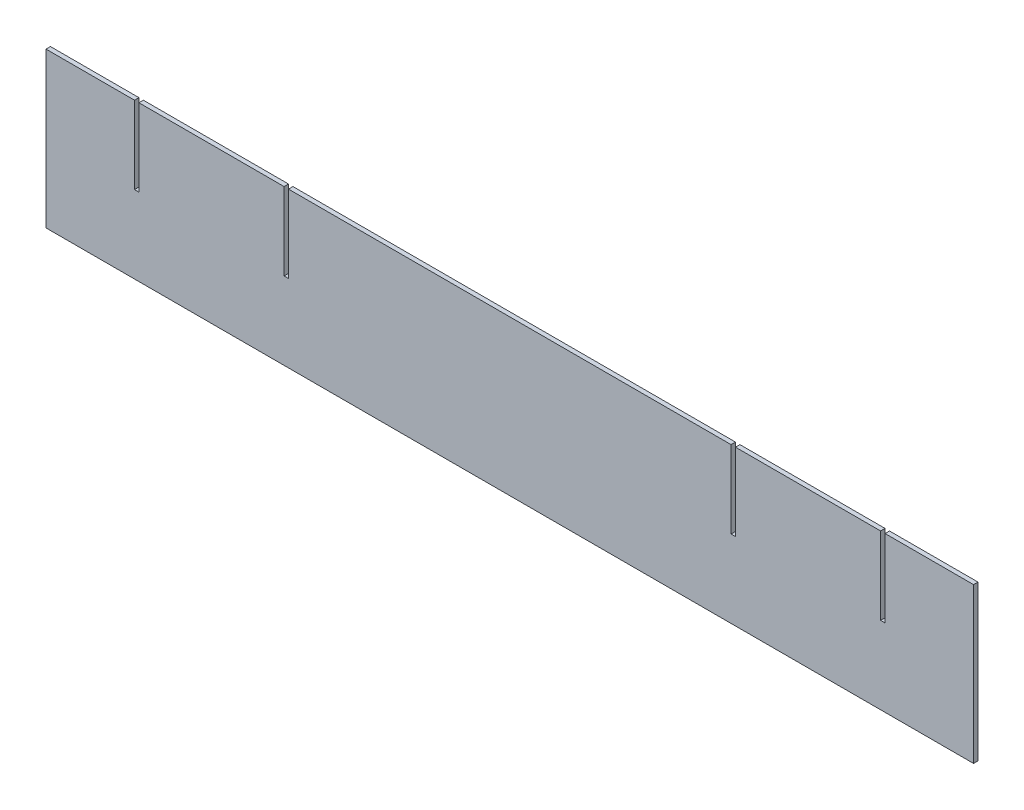
ISO-10303-21;
HEADER;
FILE_DESCRIPTION(('STEP AP214'),'2;1');
FILE_NAME('part.step','',(''),(''),'','','');
FILE_SCHEMA(('AUTOMOTIVE_DESIGN { 1 0 10303 214 1 1 1 1 }'));
ENDSEC;
DATA;
#1=APPLICATION_CONTEXT('core data for automotive mechanical design processes');
#2=APPLICATION_PROTOCOL_DEFINITION('international standard','automotive_design',2000,#1);
#3=PRODUCT_CONTEXT('',#1,'mechanical');
#4=PRODUCT('Part','Part','',(#3));
#5=PRODUCT_RELATED_PRODUCT_CATEGORY('part','',(#4));
#6=PRODUCT_DEFINITION_FORMATION('','',#4);
#7=PRODUCT_DEFINITION_CONTEXT('part definition',#1,'design');
#8=PRODUCT_DEFINITION('design','',#6,#7);
#9=PRODUCT_DEFINITION_SHAPE('','',#8);
#10=(LENGTH_UNIT() NAMED_UNIT(*) SI_UNIT(.MILLI.,.METRE.));
#11=(NAMED_UNIT(*) PLANE_ANGLE_UNIT() SI_UNIT($,.RADIAN.));
#12=(NAMED_UNIT(*) SI_UNIT($,.STERADIAN.) SOLID_ANGLE_UNIT());
#13=UNCERTAINTY_MEASURE_WITH_UNIT(LENGTH_MEASURE(1.E-05),#10,'distance_accuracy_value','');
#14=(GEOMETRIC_REPRESENTATION_CONTEXT(3) GLOBAL_UNCERTAINTY_ASSIGNED_CONTEXT((#13)) GLOBAL_UNIT_ASSIGNED_CONTEXT((#10,
#11,#12)) REPRESENTATION_CONTEXT('',''));
#15=CARTESIAN_POINT('',(0.,0.,0.));
#16=DIRECTION('',(0.,0.,1.));
#17=DIRECTION('',(1.,0.,0.));
#18=AXIS2_PLACEMENT_3D('',#15,#16,#17);
#19=CARTESIAN_POINT('',(-209.6,35.,2.));
#20=DIRECTION('',(0.,-1.,0.));
#21=DIRECTION('',(0.,0.,-1.));
#22=AXIS2_PLACEMENT_3D('',#19,#20,#21);
#23=PLANE('',#22);
#24=DIRECTION('',(-1.,0.,0.));
#25=VECTOR('',#24,1.);
#26=CARTESIAN_POINT('',(-209.6,35.,0.));
#27=LINE('',#26,#25);
#28=CARTESIAN_POINT('',(167.6,35.,0.));
#29=VERTEX_POINT('',#28);
#30=CARTESIAN_POINT('',(102.,35.,0.));
#31=VERTEX_POINT('',#30);
#32=EDGE_CURVE('E193',#29,#31,#27,.T.);
#33=ORIENTED_EDGE('',*,*,#32,.T.);
#34=DIRECTION('',(0.,0.,1.));
#35=VECTOR('',#34,1.);
#36=CARTESIAN_POINT('',(102.,35.,0.));
#37=LINE('',#36,#35);
#38=CARTESIAN_POINT('',(102.,35.,2.));
#39=VERTEX_POINT('',#38);
#40=EDGE_CURVE('E285',#31,#39,#37,.T.);
#41=ORIENTED_EDGE('',*,*,#40,.T.);
#42=DIRECTION('',(-1.,0.,0.));
#43=VECTOR('',#42,1.);
#44=CARTESIAN_POINT('',(-209.6,35.,2.));
#45=LINE('',#44,#43);
#46=CARTESIAN_POINT('',(167.6,35.,2.));
#47=VERTEX_POINT('',#46);
#48=EDGE_CURVE('E250',#47,#39,#45,.T.);
#49=ORIENTED_EDGE('',*,*,#48,.F.);
#50=DIRECTION('',(0.,0.,1.));
#51=VECTOR('',#50,1.);
#52=CARTESIAN_POINT('',(167.6,35.,0.));
#53=LINE('',#52,#51);
#54=EDGE_CURVE('E247',#29,#47,#53,.T.);
#55=ORIENTED_EDGE('',*,*,#54,.F.);
#56=EDGE_LOOP('',(#33,#41,#49,#55));
#57=FACE_BOUND('',#56,.T.);
#58=ADVANCED_FACE('F32',(#57),#23,.F.);
#59=CARTESIAN_POINT('',(100.,35.,2.));
#60=VERTEX_POINT('',#59);
#61=CARTESIAN_POINT('',(-100.,35.,2.));
#62=VERTEX_POINT('',#61);
#63=EDGE_CURVE('E186',#60,#62,#45,.T.);
#64=ORIENTED_EDGE('',*,*,#63,.F.);
#65=DIRECTION('',(0.,0.,1.));
#66=VECTOR('',#65,1.);
#67=CARTESIAN_POINT('',(100.,35.,0.));
#68=LINE('',#67,#66);
#69=CARTESIAN_POINT('',(100.,35.,0.));
#70=VERTEX_POINT('',#69);
#71=EDGE_CURVE('E172',#70,#60,#68,.T.);
#72=ORIENTED_EDGE('',*,*,#71,.F.);
#73=CARTESIAN_POINT('',(-100.,35.,0.));
#74=VERTEX_POINT('',#73);
#75=EDGE_CURVE('E184',#70,#74,#27,.T.);
#76=ORIENTED_EDGE('',*,*,#75,.T.);
#77=DIRECTION('',(0.,0.,1.));
#78=VECTOR('',#77,1.);
#79=CARTESIAN_POINT('',(-100.,35.,0.));
#80=LINE('',#79,#78);
#81=EDGE_CURVE('E343',#74,#62,#80,.T.);
#82=ORIENTED_EDGE('',*,*,#81,.T.);
#83=EDGE_LOOP('',(#64,#72,#76,#82));
#84=FACE_BOUND('',#83,.T.);
#85=ADVANCED_FACE('F182',(#84),#23,.F.);
#86=CARTESIAN_POINT('',(-102.,35.,2.));
#87=VERTEX_POINT('',#86);
#88=CARTESIAN_POINT('',(-167.6,35.,2.));
#89=VERTEX_POINT('',#88);
#90=EDGE_CURVE('E243',#87,#89,#45,.T.);
#91=ORIENTED_EDGE('',*,*,#90,.F.);
#92=DIRECTION('',(0.,0.,1.));
#93=VECTOR('',#92,1.);
#94=CARTESIAN_POINT('',(-102.,35.,0.));
#95=LINE('',#94,#93);
#96=CARTESIAN_POINT('',(-102.,35.,0.));
#97=VERTEX_POINT('',#96);
#98=EDGE_CURVE('E320',#97,#87,#95,.T.);
#99=ORIENTED_EDGE('',*,*,#98,.F.);
#100=CARTESIAN_POINT('',(-167.6,35.,0.));
#101=VERTEX_POINT('',#100);
#102=EDGE_CURVE('E194',#97,#101,#27,.T.);
#103=ORIENTED_EDGE('',*,*,#102,.T.);
#104=DIRECTION('',(0.,0.,1.));
#105=VECTOR('',#104,1.);
#106=CARTESIAN_POINT('',(-167.6,35.,0.));
#107=LINE('',#106,#105);
#108=EDGE_CURVE('E322',#101,#89,#107,.T.);
#109=ORIENTED_EDGE('',*,*,#108,.T.);
#110=EDGE_LOOP('',(#91,#99,#103,#109));
#111=FACE_BOUND('',#110,.T.);
#112=ADVANCED_FACE('F319',(#111),#23,.F.);
#113=CARTESIAN_POINT('',(209.6,35.,0.));
#114=VERTEX_POINT('',#113);
#115=CARTESIAN_POINT('',(169.6,35.,0.));
#116=VERTEX_POINT('',#115);
#117=EDGE_CURVE('E197',#114,#116,#27,.T.);
#118=ORIENTED_EDGE('',*,*,#117,.T.);
#119=DIRECTION('',(0.,0.,1.));
#120=VECTOR('',#119,1.);
#121=CARTESIAN_POINT('',(169.6,35.,0.));
#122=LINE('',#121,#120);
#123=CARTESIAN_POINT('',(169.6,35.,2.));
#124=VERTEX_POINT('',#123);
#125=EDGE_CURVE('E289',#116,#124,#122,.T.);
#126=ORIENTED_EDGE('',*,*,#125,.T.);
#127=CARTESIAN_POINT('',(209.6,35.,2.));
#128=VERTEX_POINT('',#127);
#129=EDGE_CURVE('E245',#128,#124,#45,.T.);
#130=ORIENTED_EDGE('',*,*,#129,.F.);
#131=DIRECTION('',(0.,0.,-1.));
#132=VECTOR('',#131,1.);
#133=CARTESIAN_POINT('',(209.6,35.,2.));
#134=LINE('',#133,#132);
#135=EDGE_CURVE('E11',#128,#114,#134,.T.);
#136=ORIENTED_EDGE('',*,*,#135,.T.);
#137=EDGE_LOOP('',(#118,#126,#130,#136));
#138=FACE_BOUND('',#137,.T.);
#139=ADVANCED_FACE('F386',(#138),#23,.F.);
#140=CARTESIAN_POINT('',(209.6,35.,2.));
#141=DIRECTION('',(-1.,0.,0.));
#142=DIRECTION('',(0.,0.,1.));
#143=AXIS2_PLACEMENT_3D('',#140,#141,#142);
#144=PLANE('',#143);
#145=DIRECTION('',(0.,1.,0.));
#146=VECTOR('',#145,1.);
#147=CARTESIAN_POINT('',(209.6,35.,0.));
#148=LINE('',#147,#146);
#149=CARTESIAN_POINT('',(209.6,-35.,0.));
#150=VERTEX_POINT('',#149);
#151=EDGE_CURVE('E204',#150,#114,#148,.T.);
#152=ORIENTED_EDGE('',*,*,#151,.T.);
#153=ORIENTED_EDGE('',*,*,#135,.F.);
#154=DIRECTION('',(0.,1.,0.));
#155=VECTOR('',#154,1.);
#156=CARTESIAN_POINT('',(209.6,35.,2.));
#157=LINE('',#156,#155);
#158=CARTESIAN_POINT('',(209.6,-35.,2.));
#159=VERTEX_POINT('',#158);
#160=EDGE_CURVE('E209',#159,#128,#157,.T.);
#161=ORIENTED_EDGE('',*,*,#160,.F.);
#162=DIRECTION('',(0.,0.,-1.));
#163=VECTOR('',#162,1.);
#164=CARTESIAN_POINT('',(209.6,-35.,2.));
#165=LINE('',#164,#163);
#166=EDGE_CURVE('E210',#159,#150,#165,.T.);
#167=ORIENTED_EDGE('',*,*,#166,.T.);
#168=EDGE_LOOP('',(#152,#153,#161,#167));
#169=FACE_BOUND('',#168,.T.);
#170=ADVANCED_FACE('F34',(#169),#144,.F.);
#171=CARTESIAN_POINT('',(-169.6,35.,2.));
#172=VERTEX_POINT('',#171);
#173=CARTESIAN_POINT('',(-209.6,35.,2.));
#174=VERTEX_POINT('',#173);
#175=EDGE_CURVE('E241',#172,#174,#45,.T.);
#176=ORIENTED_EDGE('',*,*,#175,.F.);
#177=DIRECTION('',(0.,0.,1.));
#178=VECTOR('',#177,1.);
#179=CARTESIAN_POINT('',(-169.6,35.,0.));
#180=LINE('',#179,#178);
#181=CARTESIAN_POINT('',(-169.6,35.,0.));
#182=VERTEX_POINT('',#181);
#183=EDGE_CURVE('E259',#182,#172,#180,.T.);
#184=ORIENTED_EDGE('',*,*,#183,.F.);
#185=CARTESIAN_POINT('',(-209.6,35.,0.));
#186=VERTEX_POINT('',#185);
#187=EDGE_CURVE('E199',#182,#186,#27,.T.);
#188=ORIENTED_EDGE('',*,*,#187,.T.);
#189=DIRECTION('',(0.,0.,-1.));
#190=VECTOR('',#189,1.);
#191=CARTESIAN_POINT('',(-209.6,35.,2.));
#192=LINE('',#191,#190);
#193=EDGE_CURVE('E40',#174,#186,#192,.T.);
#194=ORIENTED_EDGE('',*,*,#193,.F.);
#195=EDGE_LOOP('',(#176,#184,#188,#194));
#196=FACE_BOUND('',#195,.T.);
#197=ADVANCED_FACE('F258',(#196),#23,.F.);
#198=CARTESIAN_POINT('',(-209.6,35.,2.));
#199=DIRECTION('',(1.,0.,0.));
#200=DIRECTION('',(0.,0.,-1.));
#201=AXIS2_PLACEMENT_3D('',#198,#199,#200);
#202=PLANE('',#201);
#203=DIRECTION('',(0.,-1.,0.));
#204=VECTOR('',#203,1.);
#205=CARTESIAN_POINT('',(-209.6,35.,0.));
#206=LINE('',#205,#204);
#207=CARTESIAN_POINT('',(-209.6,-35.,0.));
#208=VERTEX_POINT('',#207);
#209=EDGE_CURVE('E203',#186,#208,#206,.T.);
#210=ORIENTED_EDGE('',*,*,#209,.T.);
#211=DIRECTION('',(0.,0.,-1.));
#212=VECTOR('',#211,1.);
#213=CARTESIAN_POINT('',(-209.6,-35.,2.));
#214=LINE('',#213,#212);
#215=CARTESIAN_POINT('',(-209.6,-35.,2.));
#216=VERTEX_POINT('',#215);
#217=EDGE_CURVE('E213',#216,#208,#214,.T.);
#218=ORIENTED_EDGE('',*,*,#217,.F.);
#219=DIRECTION('',(0.,-1.,0.));
#220=VECTOR('',#219,1.);
#221=CARTESIAN_POINT('',(-209.6,35.,2.));
#222=LINE('',#221,#220);
#223=EDGE_CURVE('E223',#174,#216,#222,.T.);
#224=ORIENTED_EDGE('',*,*,#223,.F.);
#225=ORIENTED_EDGE('',*,*,#193,.T.);
#226=EDGE_LOOP('',(#210,#218,#224,#225));
#227=FACE_BOUND('',#226,.T.);
#228=ADVANCED_FACE('F221',(#227),#202,.F.);
#229=CARTESIAN_POINT('',(-209.6,-35.,2.));
#230=DIRECTION('',(0.,1.,0.));
#231=DIRECTION('',(0.,0.,1.));
#232=AXIS2_PLACEMENT_3D('',#229,#230,#231);
#233=PLANE('',#232);
#234=DIRECTION('',(1.,0.,0.));
#235=VECTOR('',#234,1.);
#236=CARTESIAN_POINT('',(-209.6,-35.,0.));
#237=LINE('',#236,#235);
#238=EDGE_CURVE('E207',#208,#150,#237,.T.);
#239=ORIENTED_EDGE('',*,*,#238,.T.);
#240=ORIENTED_EDGE('',*,*,#166,.F.);
#241=DIRECTION('',(1.,0.,0.));
#242=VECTOR('',#241,1.);
#243=CARTESIAN_POINT('',(-209.6,-35.,2.));
#244=LINE('',#243,#242);
#245=EDGE_CURVE('E214',#216,#159,#244,.T.);
#246=ORIENTED_EDGE('',*,*,#245,.F.);
#247=ORIENTED_EDGE('',*,*,#217,.T.);
#248=EDGE_LOOP('',(#239,#240,#246,#247));
#249=FACE_BOUND('',#248,.T.);
#250=ADVANCED_FACE('F233',(#249),#233,.F.);
#251=CARTESIAN_POINT('',(0.,0.,2.));
#252=DIRECTION('',(0.,0.,1.));
#253=DIRECTION('',(1.,0.,0.));
#254=AXIS2_PLACEMENT_3D('',#251,#252,#253);
#255=PLANE('',#254);
#256=DIRECTION('',(0.,1.,0.));
#257=VECTOR('',#256,1.);
#258=CARTESIAN_POINT('',(102.,35.,2.));
#259=LINE('',#258,#257);
#260=CARTESIAN_POINT('',(102.,0.,2.));
#261=VERTEX_POINT('',#260);
#262=EDGE_CURVE('E177',#261,#39,#259,.T.);
#263=ORIENTED_EDGE('',*,*,#262,.F.);
#264=DIRECTION('',(1.,0.,0.));
#265=VECTOR('',#264,1.);
#266=CARTESIAN_POINT('',(102.,0.,2.));
#267=LINE('',#266,#265);
#268=CARTESIAN_POINT('',(100.,0.,2.));
#269=VERTEX_POINT('',#268);
#270=EDGE_CURVE('E360',#269,#261,#267,.T.);
#271=ORIENTED_EDGE('',*,*,#270,.F.);
#272=DIRECTION('',(0.,-1.,0.));
#273=VECTOR('',#272,1.);
#274=CARTESIAN_POINT('',(100.,0.,2.));
#275=LINE('',#274,#273);
#276=EDGE_CURVE('E345',#60,#269,#275,.T.);
#277=ORIENTED_EDGE('',*,*,#276,.F.);
#278=ORIENTED_EDGE('',*,*,#63,.T.);
#279=DIRECTION('',(0.,1.,0.));
#280=VECTOR('',#279,1.);
#281=CARTESIAN_POINT('',(-100.,35.,2.));
#282=LINE('',#281,#280);
#283=CARTESIAN_POINT('',(-100.,0.,2.));
#284=VERTEX_POINT('',#283);
#285=EDGE_CURVE('E346',#284,#62,#282,.T.);
#286=ORIENTED_EDGE('',*,*,#285,.F.);
#287=DIRECTION('',(1.,0.,0.));
#288=VECTOR('',#287,1.);
#289=CARTESIAN_POINT('',(-100.,0.,2.));
#290=LINE('',#289,#288);
#291=CARTESIAN_POINT('',(-102.,0.,2.));
#292=VERTEX_POINT('',#291);
#293=EDGE_CURVE('E326',#292,#284,#290,.T.);
#294=ORIENTED_EDGE('',*,*,#293,.F.);
#295=DIRECTION('',(0.,-1.,0.));
#296=VECTOR('',#295,1.);
#297=CARTESIAN_POINT('',(-102.,0.,2.));
#298=LINE('',#297,#296);
#299=EDGE_CURVE('E315',#87,#292,#298,.T.);
#300=ORIENTED_EDGE('',*,*,#299,.F.);
#301=ORIENTED_EDGE('',*,*,#90,.T.);
#302=DIRECTION('',(0.,1.,0.));
#303=VECTOR('',#302,1.);
#304=CARTESIAN_POINT('',(-167.6,35.,2.));
#305=LINE('',#304,#303);
#306=CARTESIAN_POINT('',(-167.6,0.,2.));
#307=VERTEX_POINT('',#306);
#308=EDGE_CURVE('E312',#307,#89,#305,.T.);
#309=ORIENTED_EDGE('',*,*,#308,.F.);
#310=DIRECTION('',(1.,0.,0.));
#311=VECTOR('',#310,1.);
#312=CARTESIAN_POINT('',(-167.6,0.,2.));
#313=LINE('',#312,#311);
#314=CARTESIAN_POINT('',(-169.6,0.,2.));
#315=VERTEX_POINT('',#314);
#316=EDGE_CURVE('E331',#315,#307,#313,.T.);
#317=ORIENTED_EDGE('',*,*,#316,.F.);
#318=DIRECTION('',(0.,-1.,0.));
#319=VECTOR('',#318,1.);
#320=CARTESIAN_POINT('',(-169.6,0.,2.));
#321=LINE('',#320,#319);
#322=EDGE_CURVE('E256',#172,#315,#321,.T.);
#323=ORIENTED_EDGE('',*,*,#322,.F.);
#324=ORIENTED_EDGE('',*,*,#175,.T.);
#325=ORIENTED_EDGE('',*,*,#223,.T.);
#326=ORIENTED_EDGE('',*,*,#245,.T.);
#327=ORIENTED_EDGE('',*,*,#160,.T.);
#328=ORIENTED_EDGE('',*,*,#129,.T.);
#329=DIRECTION('',(0.,1.,0.));
#330=VECTOR('',#329,1.);
#331=CARTESIAN_POINT('',(169.6,35.,2.));
#332=LINE('',#331,#330);
#333=CARTESIAN_POINT('',(169.6,0.,2.));
#334=VERTEX_POINT('',#333);
#335=EDGE_CURVE('E275',#334,#124,#332,.T.);
#336=ORIENTED_EDGE('',*,*,#335,.F.);
#337=DIRECTION('',(1.,0.,0.));
#338=VECTOR('',#337,1.);
#339=CARTESIAN_POINT('',(169.6,0.,2.));
#340=LINE('',#339,#338);
#341=CARTESIAN_POINT('',(167.6,0.,2.));
#342=VERTEX_POINT('',#341);
#343=EDGE_CURVE('E284',#342,#334,#340,.T.);
#344=ORIENTED_EDGE('',*,*,#343,.F.);
#345=DIRECTION('',(0.,-1.,0.));
#346=VECTOR('',#345,1.);
#347=CARTESIAN_POINT('',(167.6,0.,2.));
#348=LINE('',#347,#346);
#349=EDGE_CURVE('E281',#47,#342,#348,.T.);
#350=ORIENTED_EDGE('',*,*,#349,.F.);
#351=ORIENTED_EDGE('',*,*,#48,.T.);
#352=EDGE_LOOP('',(#263,#271,#277,#278,#286,#294,#300,#301,#309,#317,#323,#324,#325,#326,#327,
#328,#336,#344,#350,#351));
#353=FACE_BOUND('',#352,.T.);
#354=ADVANCED_FACE('F252',(#353),#255,.T.);
#355=CARTESIAN_POINT('',(0.,0.,0.));
#356=DIRECTION('',(0.,0.,1.));
#357=DIRECTION('',(1.,0.,0.));
#358=AXIS2_PLACEMENT_3D('',#355,#356,#357);
#359=PLANE('',#358);
#360=DIRECTION('',(1.,0.,0.));
#361=VECTOR('',#360,1.);
#362=CARTESIAN_POINT('',(102.,0.,0.));
#363=LINE('',#362,#361);
#364=CARTESIAN_POINT('',(100.,0.,0.));
#365=VERTEX_POINT('',#364);
#366=CARTESIAN_POINT('',(102.,0.,0.));
#367=VERTEX_POINT('',#366);
#368=EDGE_CURVE('E47',#365,#367,#363,.T.);
#369=ORIENTED_EDGE('',*,*,#368,.T.);
#370=DIRECTION('',(0.,1.,0.));
#371=VECTOR('',#370,1.);
#372=CARTESIAN_POINT('',(102.,35.,0.));
#373=LINE('',#372,#371);
#374=EDGE_CURVE('E187',#367,#31,#373,.T.);
#375=ORIENTED_EDGE('',*,*,#374,.T.);
#376=ORIENTED_EDGE('',*,*,#32,.F.);
#377=DIRECTION('',(0.,-1.,0.));
#378=VECTOR('',#377,1.);
#379=CARTESIAN_POINT('',(167.6,0.,0.));
#380=LINE('',#379,#378);
#381=CARTESIAN_POINT('',(167.6,0.,0.));
#382=VERTEX_POINT('',#381);
#383=EDGE_CURVE('E271',#29,#382,#380,.T.);
#384=ORIENTED_EDGE('',*,*,#383,.T.);
#385=DIRECTION('',(1.,0.,0.));
#386=VECTOR('',#385,1.);
#387=CARTESIAN_POINT('',(169.6,0.,0.));
#388=LINE('',#387,#386);
#389=CARTESIAN_POINT('',(169.6,0.,0.));
#390=VERTEX_POINT('',#389);
#391=EDGE_CURVE('E274',#382,#390,#388,.T.);
#392=ORIENTED_EDGE('',*,*,#391,.T.);
#393=DIRECTION('',(0.,1.,0.));
#394=VECTOR('',#393,1.);
#395=CARTESIAN_POINT('',(169.6,35.,0.));
#396=LINE('',#395,#394);
#397=EDGE_CURVE('E278',#390,#116,#396,.T.);
#398=ORIENTED_EDGE('',*,*,#397,.T.);
#399=ORIENTED_EDGE('',*,*,#117,.F.);
#400=ORIENTED_EDGE('',*,*,#151,.F.);
#401=ORIENTED_EDGE('',*,*,#238,.F.);
#402=ORIENTED_EDGE('',*,*,#209,.F.);
#403=ORIENTED_EDGE('',*,*,#187,.F.);
#404=DIRECTION('',(0.,-1.,0.));
#405=VECTOR('',#404,1.);
#406=CARTESIAN_POINT('',(-169.6,0.,0.));
#407=LINE('',#406,#405);
#408=CARTESIAN_POINT('',(-169.6,0.,0.));
#409=VERTEX_POINT('',#408);
#410=EDGE_CURVE('E330',#182,#409,#407,.T.);
#411=ORIENTED_EDGE('',*,*,#410,.T.);
#412=DIRECTION('',(1.,0.,0.));
#413=VECTOR('',#412,1.);
#414=CARTESIAN_POINT('',(-167.6,0.,0.));
#415=LINE('',#414,#413);
#416=CARTESIAN_POINT('',(-167.6,0.,0.));
#417=VERTEX_POINT('',#416);
#418=EDGE_CURVE('E267',#409,#417,#415,.T.);
#419=ORIENTED_EDGE('',*,*,#418,.T.);
#420=DIRECTION('',(0.,1.,0.));
#421=VECTOR('',#420,1.);
#422=CARTESIAN_POINT('',(-167.6,35.,0.));
#423=LINE('',#422,#421);
#424=EDGE_CURVE('E262',#417,#101,#423,.T.);
#425=ORIENTED_EDGE('',*,*,#424,.T.);
#426=ORIENTED_EDGE('',*,*,#102,.F.);
#427=DIRECTION('',(0.,-1.,0.));
#428=VECTOR('',#427,1.);
#429=CARTESIAN_POINT('',(-102.,0.,0.));
#430=LINE('',#429,#428);
#431=CARTESIAN_POINT('',(-102.,0.,0.));
#432=VERTEX_POINT('',#431);
#433=EDGE_CURVE('E348',#97,#432,#430,.T.);
#434=ORIENTED_EDGE('',*,*,#433,.T.);
#435=DIRECTION('',(1.,0.,0.));
#436=VECTOR('',#435,1.);
#437=CARTESIAN_POINT('',(-100.,0.,0.));
#438=LINE('',#437,#436);
#439=CARTESIAN_POINT('',(-100.,0.,0.));
#440=VERTEX_POINT('',#439);
#441=EDGE_CURVE('E55',#432,#440,#438,.T.);
#442=ORIENTED_EDGE('',*,*,#441,.T.);
#443=DIRECTION('',(0.,1.,0.));
#444=VECTOR('',#443,1.);
#445=CARTESIAN_POINT('',(-100.,35.,0.));
#446=LINE('',#445,#444);
#447=EDGE_CURVE('E192',#440,#74,#446,.T.);
#448=ORIENTED_EDGE('',*,*,#447,.T.);
#449=ORIENTED_EDGE('',*,*,#75,.F.);
#450=DIRECTION('',(0.,-1.,0.));
#451=VECTOR('',#450,1.);
#452=CARTESIAN_POINT('',(100.,0.,0.));
#453=LINE('',#452,#451);
#454=EDGE_CURVE('E168',#70,#365,#453,.T.);
#455=ORIENTED_EDGE('',*,*,#454,.T.);
#456=EDGE_LOOP('',(#369,#375,#376,#384,#392,#398,#399,#400,#401,#402,#403,#411,#419,#425,#426,
#434,#442,#448,#449,#455));
#457=FACE_BOUND('',#456,.T.);
#458=ADVANCED_FACE('F190',(#457),#359,.F.);
#459=CARTESIAN_POINT('',(169.6,35.,0.));
#460=DIRECTION('',(1.,0.,0.));
#461=DIRECTION('',(0.,0.,-1.));
#462=AXIS2_PLACEMENT_3D('',#459,#460,#461);
#463=PLANE('',#462);
#464=ORIENTED_EDGE('',*,*,#335,.T.);
#465=ORIENTED_EDGE('',*,*,#125,.F.);
#466=ORIENTED_EDGE('',*,*,#397,.F.);
#467=DIRECTION('',(0.,0.,1.));
#468=VECTOR('',#467,1.);
#469=CARTESIAN_POINT('',(169.6,0.,0.));
#470=LINE('',#469,#468);
#471=EDGE_CURVE('E292',#390,#334,#470,.T.);
#472=ORIENTED_EDGE('',*,*,#471,.T.);
#473=EDGE_LOOP('',(#464,#465,#466,#472));
#474=FACE_BOUND('',#473,.T.);
#475=ADVANCED_FACE('F398',(#474),#463,.F.);
#476=CARTESIAN_POINT('',(169.6,0.,0.));
#477=DIRECTION('',(0.,-1.,0.));
#478=DIRECTION('',(1.,0.,0.));
#479=AXIS2_PLACEMENT_3D('',#476,#477,#478);
#480=PLANE('',#479);
#481=ORIENTED_EDGE('',*,*,#343,.T.);
#482=ORIENTED_EDGE('',*,*,#471,.F.);
#483=ORIENTED_EDGE('',*,*,#391,.F.);
#484=DIRECTION('',(0.,0.,1.));
#485=VECTOR('',#484,1.);
#486=CARTESIAN_POINT('',(167.6,0.,0.));
#487=LINE('',#486,#485);
#488=EDGE_CURVE('E293',#382,#342,#487,.T.);
#489=ORIENTED_EDGE('',*,*,#488,.T.);
#490=EDGE_LOOP('',(#481,#482,#483,#489));
#491=FACE_BOUND('',#490,.T.);
#492=ADVANCED_FACE('F399',(#491),#480,.F.);
#493=CARTESIAN_POINT('',(167.6,0.,0.));
#494=DIRECTION('',(-1.,0.,0.));
#495=DIRECTION('',(0.,0.,1.));
#496=AXIS2_PLACEMENT_3D('',#493,#494,#495);
#497=PLANE('',#496);
#498=ORIENTED_EDGE('',*,*,#349,.T.);
#499=ORIENTED_EDGE('',*,*,#488,.F.);
#500=ORIENTED_EDGE('',*,*,#383,.F.);
#501=ORIENTED_EDGE('',*,*,#54,.T.);
#502=EDGE_LOOP('',(#498,#499,#500,#501));
#503=FACE_BOUND('',#502,.T.);
#504=ADVANCED_FACE('F299',(#503),#497,.F.);
#505=CARTESIAN_POINT('',(-167.6,35.,0.));
#506=DIRECTION('',(1.,0.,0.));
#507=DIRECTION('',(0.,1.,0.));
#508=AXIS2_PLACEMENT_3D('',#505,#506,#507);
#509=PLANE('',#508);
#510=ORIENTED_EDGE('',*,*,#308,.T.);
#511=ORIENTED_EDGE('',*,*,#108,.F.);
#512=ORIENTED_EDGE('',*,*,#424,.F.);
#513=DIRECTION('',(0.,0.,1.));
#514=VECTOR('',#513,1.);
#515=CARTESIAN_POINT('',(-167.6,0.,0.));
#516=LINE('',#515,#514);
#517=EDGE_CURVE('E264',#417,#307,#516,.T.);
#518=ORIENTED_EDGE('',*,*,#517,.T.);
#519=EDGE_LOOP('',(#510,#511,#512,#518));
#520=FACE_BOUND('',#519,.T.);
#521=ADVANCED_FACE('F406',(#520),#509,.F.);
#522=CARTESIAN_POINT('',(-167.6,0.,0.));
#523=DIRECTION('',(0.,-1.,0.));
#524=DIRECTION('',(0.,0.,-1.));
#525=AXIS2_PLACEMENT_3D('',#522,#523,#524);
#526=PLANE('',#525);
#527=ORIENTED_EDGE('',*,*,#316,.T.);
#528=ORIENTED_EDGE('',*,*,#517,.F.);
#529=ORIENTED_EDGE('',*,*,#418,.F.);
#530=DIRECTION('',(0.,0.,1.));
#531=VECTOR('',#530,1.);
#532=CARTESIAN_POINT('',(-169.6,0.,0.));
#533=LINE('',#532,#531);
#534=EDGE_CURVE('E261',#409,#315,#533,.T.);
#535=ORIENTED_EDGE('',*,*,#534,.T.);
#536=EDGE_LOOP('',(#527,#528,#529,#535));
#537=FACE_BOUND('',#536,.T.);
#538=ADVANCED_FACE('F452',(#537),#526,.F.);
#539=CARTESIAN_POINT('',(-169.6,0.,0.));
#540=DIRECTION('',(-1.,0.,0.));
#541=DIRECTION('',(0.,0.,1.));
#542=AXIS2_PLACEMENT_3D('',#539,#540,#541);
#543=PLANE('',#542);
#544=ORIENTED_EDGE('',*,*,#322,.T.);
#545=ORIENTED_EDGE('',*,*,#534,.F.);
#546=ORIENTED_EDGE('',*,*,#410,.F.);
#547=ORIENTED_EDGE('',*,*,#183,.T.);
#548=EDGE_LOOP('',(#544,#545,#546,#547));
#549=FACE_BOUND('',#548,.T.);
#550=ADVANCED_FACE('F461',(#549),#543,.F.);
#551=CARTESIAN_POINT('',(-100.,35.,0.));
#552=DIRECTION('',(1.,0.,0.));
#553=DIRECTION('',(0.,0.,-1.));
#554=AXIS2_PLACEMENT_3D('',#551,#552,#553);
#555=PLANE('',#554);
#556=ORIENTED_EDGE('',*,*,#285,.T.);
#557=ORIENTED_EDGE('',*,*,#81,.F.);
#558=ORIENTED_EDGE('',*,*,#447,.F.);
#559=DIRECTION('',(0.,0.,1.));
#560=VECTOR('',#559,1.);
#561=CARTESIAN_POINT('',(-100.,0.,0.));
#562=LINE('',#561,#560);
#563=EDGE_CURVE('E341',#440,#284,#562,.T.);
#564=ORIENTED_EDGE('',*,*,#563,.T.);
#565=EDGE_LOOP('',(#556,#557,#558,#564));
#566=FACE_BOUND('',#565,.T.);
#567=ADVANCED_FACE('F471',(#566),#555,.F.);
#568=CARTESIAN_POINT('',(-100.,0.,0.));
#569=DIRECTION('',(0.,-1.,0.));
#570=DIRECTION('',(0.,0.,-1.));
#571=AXIS2_PLACEMENT_3D('',#568,#569,#570);
#572=PLANE('',#571);
#573=ORIENTED_EDGE('',*,*,#293,.T.);
#574=ORIENTED_EDGE('',*,*,#563,.F.);
#575=ORIENTED_EDGE('',*,*,#441,.F.);
#576=DIRECTION('',(0.,0.,1.));
#577=VECTOR('',#576,1.);
#578=CARTESIAN_POINT('',(-102.,0.,0.));
#579=LINE('',#578,#577);
#580=EDGE_CURVE('E339',#432,#292,#579,.T.);
#581=ORIENTED_EDGE('',*,*,#580,.T.);
#582=EDGE_LOOP('',(#573,#574,#575,#581));
#583=FACE_BOUND('',#582,.T.);
#584=ADVANCED_FACE('F479',(#583),#572,.F.);
#585=CARTESIAN_POINT('',(-102.,0.,0.));
#586=DIRECTION('',(-1.,0.,0.));
#587=DIRECTION('',(0.,0.,1.));
#588=AXIS2_PLACEMENT_3D('',#585,#586,#587);
#589=PLANE('',#588);
#590=ORIENTED_EDGE('',*,*,#299,.T.);
#591=ORIENTED_EDGE('',*,*,#580,.F.);
#592=ORIENTED_EDGE('',*,*,#433,.F.);
#593=ORIENTED_EDGE('',*,*,#98,.T.);
#594=EDGE_LOOP('',(#590,#591,#592,#593));
#595=FACE_BOUND('',#594,.T.);
#596=ADVANCED_FACE('F378',(#595),#589,.F.);
#597=CARTESIAN_POINT('',(102.,35.,0.));
#598=DIRECTION('',(1.,0.,0.));
#599=DIRECTION('',(0.,1.,0.));
#600=AXIS2_PLACEMENT_3D('',#597,#598,#599);
#601=PLANE('',#600);
#602=ORIENTED_EDGE('',*,*,#262,.T.);
#603=ORIENTED_EDGE('',*,*,#40,.F.);
#604=ORIENTED_EDGE('',*,*,#374,.F.);
#605=DIRECTION('',(0.,0.,1.));
#606=VECTOR('',#605,1.);
#607=CARTESIAN_POINT('',(102.,0.,0.));
#608=LINE('',#607,#606);
#609=EDGE_CURVE('E356',#367,#261,#608,.T.);
#610=ORIENTED_EDGE('',*,*,#609,.T.);
#611=EDGE_LOOP('',(#602,#603,#604,#610));
#612=FACE_BOUND('',#611,.T.);
#613=ADVANCED_FACE('F368',(#612),#601,.F.);
#614=CARTESIAN_POINT('',(102.,0.,0.));
#615=DIRECTION('',(0.,-1.,0.));
#616=DIRECTION('',(0.,0.,-1.));
#617=AXIS2_PLACEMENT_3D('',#614,#615,#616);
#618=PLANE('',#617);
#619=ORIENTED_EDGE('',*,*,#270,.T.);
#620=ORIENTED_EDGE('',*,*,#609,.F.);
#621=ORIENTED_EDGE('',*,*,#368,.F.);
#622=DIRECTION('',(0.,0.,1.));
#623=VECTOR('',#622,1.);
#624=CARTESIAN_POINT('',(100.,0.,0.));
#625=LINE('',#624,#623);
#626=EDGE_CURVE('E174',#365,#269,#625,.T.);
#627=ORIENTED_EDGE('',*,*,#626,.T.);
#628=EDGE_LOOP('',(#619,#620,#621,#627));
#629=FACE_BOUND('',#628,.T.);
#630=ADVANCED_FACE('F370',(#629),#618,.F.);
#631=CARTESIAN_POINT('',(100.,0.,0.));
#632=DIRECTION('',(-1.,0.,0.));
#633=DIRECTION('',(0.,0.,1.));
#634=AXIS2_PLACEMENT_3D('',#631,#632,#633);
#635=PLANE('',#634);
#636=ORIENTED_EDGE('',*,*,#276,.T.);
#637=ORIENTED_EDGE('',*,*,#626,.F.);
#638=ORIENTED_EDGE('',*,*,#454,.F.);
#639=ORIENTED_EDGE('',*,*,#71,.T.);
#640=EDGE_LOOP('',(#636,#637,#638,#639));
#641=FACE_BOUND('',#640,.T.);
#642=ADVANCED_FACE('F171',(#641),#635,.F.);
#643=CLOSED_SHELL('',(#58,#85,#112,#139,#170,#197,#228,#250,#354,#458,#475,#492,#504,#521,#538,
#550,#567,#584,#596,#613,#630,#642));
#644=MANIFOLD_SOLID_BREP('B2',#643);
#645=ADVANCED_BREP_SHAPE_REPRESENTATION('',(#18,#644),#14);
#646=SHAPE_DEFINITION_REPRESENTATION(#9,#645);
ENDSEC;
END-ISO-10303-21;
